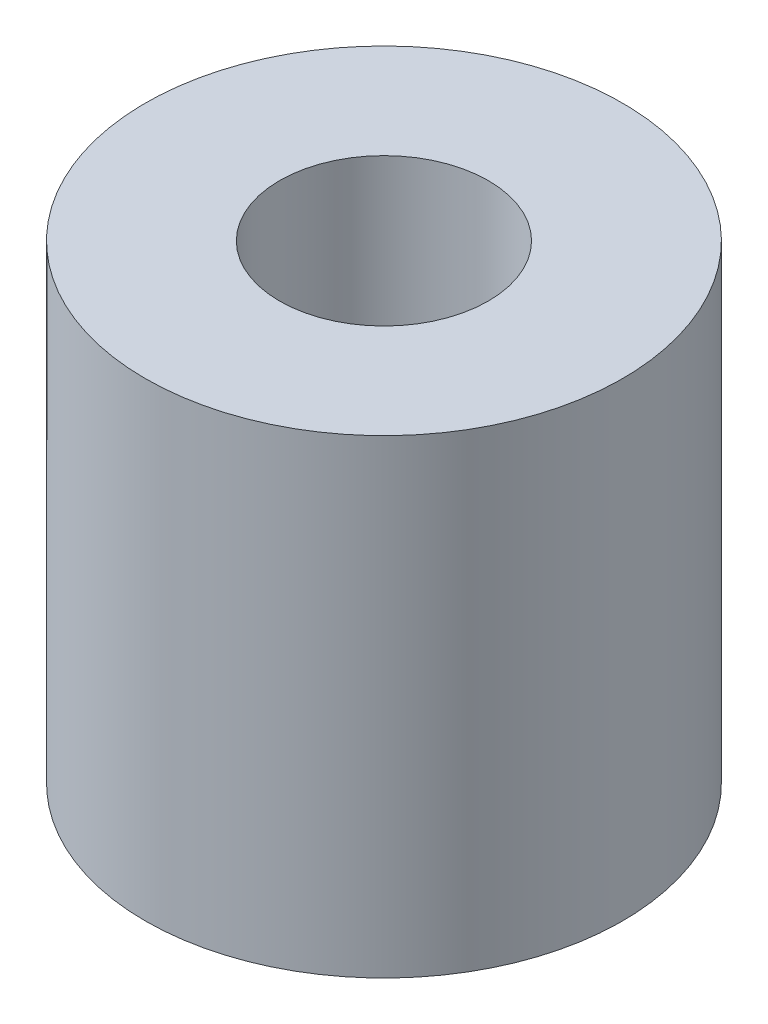
ISO-10303-21;
HEADER;
FILE_DESCRIPTION(('STEP AP214'),'2;1');
FILE_NAME('part.step','',(''),(''),'','','');
FILE_SCHEMA(('AUTOMOTIVE_DESIGN { 1 0 10303 214 1 1 1 1 }'));
ENDSEC;
DATA;
#1=APPLICATION_CONTEXT('core data for automotive mechanical design processes');
#2=APPLICATION_PROTOCOL_DEFINITION('international standard','automotive_design',2000,#1);
#3=PRODUCT_CONTEXT('',#1,'mechanical');
#4=PRODUCT('Part','Part','',(#3));
#5=PRODUCT_RELATED_PRODUCT_CATEGORY('part','',(#4));
#6=PRODUCT_DEFINITION_FORMATION('','',#4);
#7=PRODUCT_DEFINITION_CONTEXT('part definition',#1,'design');
#8=PRODUCT_DEFINITION('design','',#6,#7);
#9=PRODUCT_DEFINITION_SHAPE('','',#8);
#10=(LENGTH_UNIT() NAMED_UNIT(*) SI_UNIT(.MILLI.,.METRE.));
#11=(NAMED_UNIT(*) PLANE_ANGLE_UNIT() SI_UNIT($,.RADIAN.));
#12=(NAMED_UNIT(*) SI_UNIT($,.STERADIAN.) SOLID_ANGLE_UNIT());
#13=UNCERTAINTY_MEASURE_WITH_UNIT(LENGTH_MEASURE(1.E-05),#10,'distance_accuracy_value','');
#14=(GEOMETRIC_REPRESENTATION_CONTEXT(3) GLOBAL_UNCERTAINTY_ASSIGNED_CONTEXT((#13)) GLOBAL_UNIT_ASSIGNED_CONTEXT((#10,
#11,#12)) REPRESENTATION_CONTEXT('',''));
#15=CARTESIAN_POINT('',(0.,0.,0.));
#16=DIRECTION('',(0.,0.,1.));
#17=DIRECTION('',(1.,0.,0.));
#18=AXIS2_PLACEMENT_3D('',#15,#16,#17);
#19=CARTESIAN_POINT('',(0.,9.,0.));
#20=DIRECTION('',(0.,1.,0.));
#21=DIRECTION('',(0.,0.,1.));
#22=AXIS2_PLACEMENT_3D('',#19,#20,#21);
#23=PLANE('',#22);
#24=CARTESIAN_POINT('',(0.,9.,0.));
#25=DIRECTION('',(0.,1.,0.));
#26=DIRECTION('',(0.,0.,1.));
#27=AXIS2_PLACEMENT_3D('',#24,#25,#26);
#28=CIRCLE('',#27,4.572);
#29=CARTESIAN_POINT('',(0.,9.,4.572));
#30=VERTEX_POINT('',#29);
#31=EDGE_CURVE('E10',#30,#30,#28,.T.);
#32=ORIENTED_EDGE('',*,*,#31,.T.);
#33=EDGE_LOOP('',(#32));
#34=FACE_BOUND('',#33,.T.);
#35=CARTESIAN_POINT('',(0.,9.,0.));
#36=DIRECTION('',(0.,1.,0.));
#37=DIRECTION('',(0.,0.,1.));
#38=AXIS2_PLACEMENT_3D('',#35,#36,#37);
#39=CIRCLE('',#38,2.);
#40=CARTESIAN_POINT('',(0.,9.,2.));
#41=VERTEX_POINT('',#40);
#42=EDGE_CURVE('E41',#41,#41,#39,.T.);
#43=ORIENTED_EDGE('',*,*,#42,.F.);
#44=EDGE_LOOP('',(#43));
#45=FACE_BOUND('',#44,.T.);
#46=ADVANCED_FACE('F30',(#34,#45),#23,.T.);
#47=CARTESIAN_POINT('',(0.,0.,0.));
#48=DIRECTION('',(0.,1.,0.));
#49=DIRECTION('',(0.,0.,1.));
#50=AXIS2_PLACEMENT_3D('',#47,#48,#49);
#51=PLANE('',#50);
#52=CARTESIAN_POINT('',(0.,0.,0.));
#53=DIRECTION('',(0.,1.,0.));
#54=DIRECTION('',(0.,0.,1.));
#55=AXIS2_PLACEMENT_3D('',#52,#53,#54);
#56=CIRCLE('',#55,4.572);
#57=CARTESIAN_POINT('',(0.,0.,4.572));
#58=VERTEX_POINT('',#57);
#59=EDGE_CURVE('E34',#58,#58,#56,.T.);
#60=ORIENTED_EDGE('',*,*,#59,.F.);
#61=EDGE_LOOP('',(#60));
#62=FACE_BOUND('',#61,.T.);
#63=CARTESIAN_POINT('',(0.,0.,0.));
#64=DIRECTION('',(0.,1.,0.));
#65=DIRECTION('',(0.,0.,1.));
#66=AXIS2_PLACEMENT_3D('',#63,#64,#65);
#67=CIRCLE('',#66,2.);
#68=CARTESIAN_POINT('',(0.,0.,2.));
#69=VERTEX_POINT('',#68);
#70=EDGE_CURVE('E43',#69,#69,#67,.T.);
#71=ORIENTED_EDGE('',*,*,#70,.T.);
#72=EDGE_LOOP('',(#71));
#73=FACE_BOUND('',#72,.T.);
#74=ADVANCED_FACE('F53',(#62,#73),#51,.F.);
#75=CARTESIAN_POINT('',(0.,9.,0.));
#76=DIRECTION('',(0.,-1.,0.));
#77=DIRECTION('',(0.,0.,-1.));
#78=AXIS2_PLACEMENT_3D('',#75,#76,#77);
#79=CYLINDRICAL_SURFACE('',#78,4.572);
#80=ORIENTED_EDGE('',*,*,#31,.F.);
#81=EDGE_LOOP('',(#80));
#82=FACE_BOUND('',#81,.T.);
#83=ORIENTED_EDGE('',*,*,#59,.T.);
#84=EDGE_LOOP('',(#83));
#85=FACE_BOUND('',#84,.T.);
#86=ADVANCED_FACE('F32',(#82,#85),#79,.T.);
#87=CARTESIAN_POINT('',(0.,9.,0.));
#88=DIRECTION('',(0.,-1.,0.));
#89=DIRECTION('',(0.,0.,-1.));
#90=AXIS2_PLACEMENT_3D('',#87,#88,#89);
#91=CYLINDRICAL_SURFACE('',#90,2.);
#92=ORIENTED_EDGE('',*,*,#42,.T.);
#93=EDGE_LOOP('',(#92));
#94=FACE_BOUND('',#93,.T.);
#95=ORIENTED_EDGE('',*,*,#70,.F.);
#96=EDGE_LOOP('',(#95));
#97=FACE_BOUND('',#96,.T.);
#98=ADVANCED_FACE('F49',(#94,#97),#91,.F.);
#99=CLOSED_SHELL('',(#46,#74,#86,#98));
#100=MANIFOLD_SOLID_BREP('B2',#99);
#101=ADVANCED_BREP_SHAPE_REPRESENTATION('',(#18,#100),#14);
#102=SHAPE_DEFINITION_REPRESENTATION(#9,#101);
ENDSEC;
END-ISO-10303-21;
